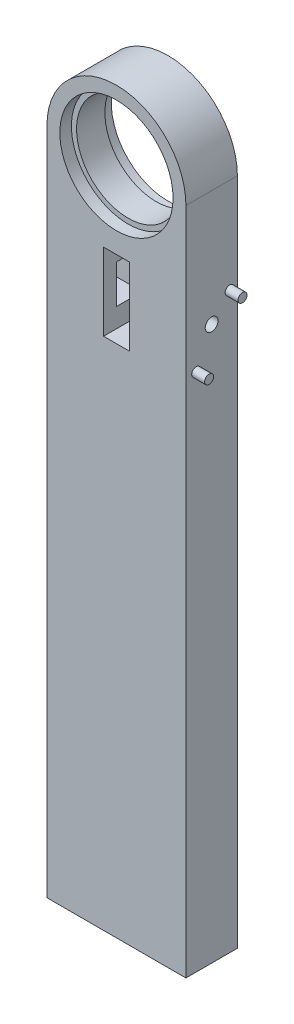
ISO-10303-21;
HEADER;
FILE_DESCRIPTION(('STEP AP214'),'2;1');
FILE_NAME('part.step','',(''),(''),'','','');
FILE_SCHEMA(('AUTOMOTIVE_DESIGN { 1 0 10303 214 1 1 1 1 }'));
ENDSEC;
DATA;
#1=APPLICATION_CONTEXT('core data for automotive mechanical design processes');
#2=APPLICATION_PROTOCOL_DEFINITION('international standard','automotive_design',2000,#1);
#3=PRODUCT_CONTEXT('',#1,'mechanical');
#4=PRODUCT('Part','Part','',(#3));
#5=PRODUCT_RELATED_PRODUCT_CATEGORY('part','',(#4));
#6=PRODUCT_DEFINITION_FORMATION('','',#4);
#7=PRODUCT_DEFINITION_CONTEXT('part definition',#1,'design');
#8=PRODUCT_DEFINITION('design','',#6,#7);
#9=PRODUCT_DEFINITION_SHAPE('','',#8);
#10=(LENGTH_UNIT() NAMED_UNIT(*) SI_UNIT(.MILLI.,.METRE.));
#11=(NAMED_UNIT(*) PLANE_ANGLE_UNIT() SI_UNIT($,.RADIAN.));
#12=(NAMED_UNIT(*) SI_UNIT($,.STERADIAN.) SOLID_ANGLE_UNIT());
#13=UNCERTAINTY_MEASURE_WITH_UNIT(LENGTH_MEASURE(1.E-05),#10,'distance_accuracy_value','');
#14=(GEOMETRIC_REPRESENTATION_CONTEXT(3) GLOBAL_UNCERTAINTY_ASSIGNED_CONTEXT((#13)) GLOBAL_UNIT_ASSIGNED_CONTEXT((#10,
#11,#12)) REPRESENTATION_CONTEXT('',''));
#15=CARTESIAN_POINT('',(0.,0.,0.));
#16=DIRECTION('',(0.,0.,1.));
#17=DIRECTION('',(1.,0.,0.));
#18=AXIS2_PLACEMENT_3D('',#15,#16,#17);
#19=CARTESIAN_POINT('',(0.,0.,-15.));
#20=DIRECTION('',(0.,0.,1.));
#21=DIRECTION('',(1.,0.,0.));
#22=AXIS2_PLACEMENT_3D('',#19,#20,#21);
#23=CYLINDRICAL_SURFACE('',#22,22.);
#24=CARTESIAN_POINT('',(0.,0.,-15.));
#25=DIRECTION('',(0.,0.,1.));
#26=DIRECTION('',(1.,0.,0.));
#27=AXIS2_PLACEMENT_3D('',#24,#25,#26);
#28=CIRCLE('',#27,22.);
#29=CARTESIAN_POINT('',(22.,0.,-15.));
#30=VERTEX_POINT('',#29);
#31=EDGE_CURVE('E237',#30,#30,#28,.T.);
#32=ORIENTED_EDGE('',*,*,#31,.F.);
#33=EDGE_LOOP('',(#32));
#34=FACE_BOUND('',#33,.T.);
#35=CARTESIAN_POINT('',(0.,0.,-10.5));
#36=DIRECTION('',(0.,0.,1.));
#37=DIRECTION('',(1.,0.,0.));
#38=AXIS2_PLACEMENT_3D('',#35,#36,#37);
#39=CIRCLE('',#38,22.);
#40=CARTESIAN_POINT('',(22.,0.,-10.5));
#41=VERTEX_POINT('',#40);
#42=EDGE_CURVE('E294',#41,#41,#39,.F.);
#43=ORIENTED_EDGE('',*,*,#42,.F.);
#44=EDGE_LOOP('',(#43));
#45=FACE_BOUND('',#44,.T.);
#46=ADVANCED_FACE('F45',(#34,#45),#23,.F.);
#47=CARTESIAN_POINT('',(0.,0.,5.));
#48=DIRECTION('',(0.,0.,1.));
#49=DIRECTION('',(1.,0.,0.));
#50=AXIS2_PLACEMENT_3D('',#47,#48,#49);
#51=PLANE('',#50);
#52=DIRECTION('',(0.,-1.,0.));
#53=VECTOR('',#52,1.);
#54=CARTESIAN_POINT('',(-5.,0.,5.));
#55=LINE('',#54,#53);
#56=CARTESIAN_POINT('',(-5.,-30.,5.));
#57=VERTEX_POINT('',#56);
#58=CARTESIAN_POINT('',(-4.99999999999999,-60.,5.));
#59=VERTEX_POINT('',#58);
#60=EDGE_CURVE('E230',#57,#59,#55,.T.);
#61=ORIENTED_EDGE('',*,*,#60,.F.);
#62=DIRECTION('',(-1.,0.,0.));
#63=VECTOR('',#62,1.);
#64=CARTESIAN_POINT('',(0.,-30.,5.));
#65=LINE('',#64,#63);
#66=CARTESIAN_POINT('',(5.,-30.,5.));
#67=VERTEX_POINT('',#66);
#68=EDGE_CURVE('E227',#67,#57,#65,.T.);
#69=ORIENTED_EDGE('',*,*,#68,.F.);
#70=DIRECTION('',(0.,1.,0.));
#71=VECTOR('',#70,1.);
#72=CARTESIAN_POINT('',(4.99999999999999,0.,5.));
#73=LINE('',#72,#71);
#74=CARTESIAN_POINT('',(5.00000000000001,-60.,5.));
#75=VERTEX_POINT('',#74);
#76=EDGE_CURVE('E224',#75,#67,#73,.T.);
#77=ORIENTED_EDGE('',*,*,#76,.F.);
#78=DIRECTION('',(1.,0.,0.));
#79=VECTOR('',#78,1.);
#80=CARTESIAN_POINT('',(0.,-60.,5.));
#81=LINE('',#80,#79);
#82=EDGE_CURVE('E211',#59,#75,#81,.T.);
#83=ORIENTED_EDGE('',*,*,#82,.F.);
#84=EDGE_LOOP('',(#61,#69,#77,#83));
#85=FACE_BOUND('',#84,.T.);
#86=DIRECTION('',(0.,-1.,0.));
#87=VECTOR('',#86,1.);
#88=CARTESIAN_POINT('',(-27.,-260.,5.));
#89=LINE('',#88,#87);
#90=CARTESIAN_POINT('',(-27.,0.,5.));
#91=VERTEX_POINT('',#90);
#92=CARTESIAN_POINT('',(-27.,-260.,5.));
#93=VERTEX_POINT('',#92);
#94=EDGE_CURVE('E265',#91,#93,#89,.T.);
#95=ORIENTED_EDGE('',*,*,#94,.T.);
#96=DIRECTION('',(1.,0.,0.));
#97=VECTOR('',#96,1.);
#98=CARTESIAN_POINT('',(-27.,-260.,5.));
#99=LINE('',#98,#97);
#100=CARTESIAN_POINT('',(27.,-260.,5.));
#101=VERTEX_POINT('',#100);
#102=EDGE_CURVE('E269',#93,#101,#99,.T.);
#103=ORIENTED_EDGE('',*,*,#102,.T.);
#104=DIRECTION('',(0.,1.,0.));
#105=VECTOR('',#104,1.);
#106=CARTESIAN_POINT('',(27.,-260.,5.));
#107=LINE('',#106,#105);
#108=CARTESIAN_POINT('',(27.,0.,5.));
#109=VERTEX_POINT('',#108);
#110=EDGE_CURVE('E272',#101,#109,#107,.T.);
#111=ORIENTED_EDGE('',*,*,#110,.T.);
#112=CARTESIAN_POINT('',(0.,0.,5.));
#113=DIRECTION('',(0.,0.,1.));
#114=DIRECTION('',(1.,0.,0.));
#115=AXIS2_PLACEMENT_3D('',#112,#113,#114);
#116=CIRCLE('',#115,27.);
#117=EDGE_CURVE('E275',#109,#91,#116,.T.);
#118=ORIENTED_EDGE('',*,*,#117,.T.);
#119=EDGE_LOOP('',(#95,#103,#111,#118));
#120=FACE_BOUND('',#119,.T.);
#121=CARTESIAN_POINT('',(0.,0.,5.));
#122=DIRECTION('',(0.,0.,1.));
#123=DIRECTION('',(1.,0.,0.));
#124=AXIS2_PLACEMENT_3D('',#121,#122,#123);
#125=CIRCLE('',#124,22.);
#126=CARTESIAN_POINT('',(22.,0.,5.));
#127=VERTEX_POINT('',#126);
#128=EDGE_CURVE('E261',#127,#127,#125,.T.);
#129=ORIENTED_EDGE('',*,*,#128,.F.);
#130=EDGE_LOOP('',(#129));
#131=FACE_BOUND('',#130,.T.);
#132=ADVANCED_FACE('F333',(#85,#120,#131),#51,.T.);
#133=CARTESIAN_POINT('',(-27.,-260.,5.));
#134=DIRECTION('',(1.,0.,0.));
#135=DIRECTION('',(0.,1.,0.));
#136=AXIS2_PLACEMENT_3D('',#133,#134,#135);
#137=PLANE('',#136);
#138=DIRECTION('',(0.,0.,-1.));
#139=VECTOR('',#138,1.);
#140=CARTESIAN_POINT('',(-27.,0.,5.));
#141=LINE('',#140,#139);
#142=CARTESIAN_POINT('',(-27.,0.,-15.));
#143=VERTEX_POINT('',#142);
#144=EDGE_CURVE('E278',#91,#143,#141,.T.);
#145=ORIENTED_EDGE('',*,*,#144,.T.);
#146=DIRECTION('',(0.,-1.,0.));
#147=VECTOR('',#146,1.);
#148=CARTESIAN_POINT('',(-27.,-260.,-15.));
#149=LINE('',#148,#147);
#150=CARTESIAN_POINT('',(-27.,-260.,-15.));
#151=VERTEX_POINT('',#150);
#152=EDGE_CURVE('E241',#143,#151,#149,.T.);
#153=ORIENTED_EDGE('',*,*,#152,.T.);
#154=DIRECTION('',(0.,0.,-1.));
#155=VECTOR('',#154,1.);
#156=CARTESIAN_POINT('',(-27.,-260.,5.));
#157=LINE('',#156,#155);
#158=EDGE_CURVE('E287',#93,#151,#157,.T.);
#159=ORIENTED_EDGE('',*,*,#158,.F.);
#160=ORIENTED_EDGE('',*,*,#94,.F.);
#161=EDGE_LOOP('',(#145,#153,#159,#160));
#162=FACE_BOUND('',#161,.T.);
#163=ADVANCED_FACE('F47',(#162),#137,.F.);
#164=CARTESIAN_POINT('',(-27.,-260.,5.));
#165=DIRECTION('',(0.,1.,0.));
#166=DIRECTION('',(0.,0.,1.));
#167=AXIS2_PLACEMENT_3D('',#164,#165,#166);
#168=PLANE('',#167);
#169=ORIENTED_EDGE('',*,*,#158,.T.);
#170=DIRECTION('',(1.,0.,0.));
#171=VECTOR('',#170,1.);
#172=CARTESIAN_POINT('',(-27.,-260.,-15.));
#173=LINE('',#172,#171);
#174=CARTESIAN_POINT('',(27.,-260.,-15.));
#175=VERTEX_POINT('',#174);
#176=EDGE_CURVE('E245',#151,#175,#173,.T.);
#177=ORIENTED_EDGE('',*,*,#176,.T.);
#178=DIRECTION('',(0.,0.,-1.));
#179=VECTOR('',#178,1.);
#180=CARTESIAN_POINT('',(27.,-260.,5.));
#181=LINE('',#180,#179);
#182=EDGE_CURVE('E284',#101,#175,#181,.T.);
#183=ORIENTED_EDGE('',*,*,#182,.F.);
#184=ORIENTED_EDGE('',*,*,#102,.F.);
#185=EDGE_LOOP('',(#169,#177,#183,#184));
#186=FACE_BOUND('',#185,.T.);
#187=ADVANCED_FACE('F310',(#186),#168,.F.);
#188=CARTESIAN_POINT('',(27.,-260.,5.));
#189=DIRECTION('',(-1.,0.,0.));
#190=DIRECTION('',(0.,-1.,0.));
#191=AXIS2_PLACEMENT_3D('',#188,#189,#190);
#192=PLANE('',#191);
#193=CARTESIAN_POINT('',(27.,-37.,-12.));
#194=DIRECTION('',(-1.,0.,0.));
#195=DIRECTION('',(0.,-1.,0.));
#196=AXIS2_PLACEMENT_3D('',#193,#194,#195);
#197=CIRCLE('',#196,1.75);
#198=CARTESIAN_POINT('',(27.,-38.75,-12.));
#199=VERTEX_POINT('',#198);
#200=EDGE_CURVE('E11',#199,#199,#197,.F.);
#201=ORIENTED_EDGE('',*,*,#200,.F.);
#202=EDGE_LOOP('',(#201));
#203=FACE_BOUND('',#202,.T.);
#204=CARTESIAN_POINT('',(27.,-58.,1.));
#205=DIRECTION('',(-1.,0.,0.));
#206=DIRECTION('',(0.,-1.,0.));
#207=AXIS2_PLACEMENT_3D('',#204,#205,#206);
#208=CIRCLE('',#207,1.75);
#209=CARTESIAN_POINT('',(27.,-59.75,1.));
#210=VERTEX_POINT('',#209);
#211=EDGE_CURVE('E54',#210,#210,#208,.F.);
#212=ORIENTED_EDGE('',*,*,#211,.F.);
#213=EDGE_LOOP('',(#212));
#214=FACE_BOUND('',#213,.T.);
#215=CARTESIAN_POINT('',(27.,-45.,-5.));
#216=DIRECTION('',(-1.,0.,0.));
#217=DIRECTION('',(0.,-1.,0.));
#218=AXIS2_PLACEMENT_3D('',#215,#216,#217);
#219=CIRCLE('',#218,2.5);
#220=CARTESIAN_POINT('',(27.,-47.5,-5.));
#221=VERTEX_POINT('',#220);
#222=EDGE_CURVE('E167',#221,#221,#219,.T.);
#223=ORIENTED_EDGE('',*,*,#222,.T.);
#224=EDGE_LOOP('',(#223));
#225=FACE_BOUND('',#224,.T.);
#226=ORIENTED_EDGE('',*,*,#182,.T.);
#227=DIRECTION('',(0.,1.,0.));
#228=VECTOR('',#227,1.);
#229=CARTESIAN_POINT('',(27.,-260.,-15.));
#230=LINE('',#229,#228);
#231=CARTESIAN_POINT('',(27.,0.,-15.));
#232=VERTEX_POINT('',#231);
#233=EDGE_CURVE('E249',#175,#232,#230,.T.);
#234=ORIENTED_EDGE('',*,*,#233,.T.);
#235=DIRECTION('',(0.,0.,-1.));
#236=VECTOR('',#235,1.);
#237=CARTESIAN_POINT('',(27.,0.,5.));
#238=LINE('',#237,#236);
#239=EDGE_CURVE('E281',#109,#232,#238,.T.);
#240=ORIENTED_EDGE('',*,*,#239,.F.);
#241=ORIENTED_EDGE('',*,*,#110,.F.);
#242=EDGE_LOOP('',(#226,#234,#240,#241));
#243=FACE_BOUND('',#242,.T.);
#244=ADVANCED_FACE('F306',(#203,#214,#225,#243),#192,.F.);
#245=CARTESIAN_POINT('',(0.,0.,5.));
#246=DIRECTION('',(0.,0.,-1.));
#247=DIRECTION('',(-1.,0.,0.));
#248=AXIS2_PLACEMENT_3D('',#245,#246,#247);
#249=CYLINDRICAL_SURFACE('',#248,27.);
#250=ORIENTED_EDGE('',*,*,#239,.T.);
#251=CARTESIAN_POINT('',(0.,0.,-15.));
#252=DIRECTION('',(0.,0.,1.));
#253=DIRECTION('',(1.,0.,0.));
#254=AXIS2_PLACEMENT_3D('',#251,#252,#253);
#255=CIRCLE('',#254,27.);
#256=EDGE_CURVE('E253',#232,#143,#255,.T.);
#257=ORIENTED_EDGE('',*,*,#256,.T.);
#258=ORIENTED_EDGE('',*,*,#144,.F.);
#259=ORIENTED_EDGE('',*,*,#117,.F.);
#260=EDGE_LOOP('',(#250,#257,#258,#259));
#261=FACE_BOUND('',#260,.T.);
#262=ADVANCED_FACE('F309',(#261),#249,.T.);
#263=CARTESIAN_POINT('',(0.,0.,5.));
#264=DIRECTION('',(0.,0.,-1.));
#265=DIRECTION('',(-1.,0.,0.));
#266=AXIS2_PLACEMENT_3D('',#263,#264,#265);
#267=CYLINDRICAL_SURFACE('',#266,22.);
#268=CARTESIAN_POINT('',(0.,0.,0.5));
#269=DIRECTION('',(0.,0.,1.));
#270=DIRECTION('',(1.,0.,0.));
#271=AXIS2_PLACEMENT_3D('',#268,#269,#270);
#272=CIRCLE('',#271,22.);
#273=CARTESIAN_POINT('',(22.,0.,0.5));
#274=VERTEX_POINT('',#273);
#275=EDGE_CURVE('E290',#274,#274,#272,.T.);
#276=ORIENTED_EDGE('',*,*,#275,.F.);
#277=EDGE_LOOP('',(#276));
#278=FACE_BOUND('',#277,.T.);
#279=ORIENTED_EDGE('',*,*,#128,.T.);
#280=EDGE_LOOP('',(#279));
#281=FACE_BOUND('',#280,.T.);
#282=ADVANCED_FACE('F340',(#278,#281),#267,.F.);
#283=CARTESIAN_POINT('',(0.,0.,0.5));
#284=DIRECTION('',(0.,0.,1.));
#285=DIRECTION('',(1.,0.,0.));
#286=AXIS2_PLACEMENT_3D('',#283,#284,#285);
#287=PLANE('',#286);
#288=ORIENTED_EDGE('',*,*,#275,.T.);
#289=EDGE_LOOP('',(#288));
#290=FACE_BOUND('',#289,.T.);
#291=CARTESIAN_POINT('',(0.,0.,0.5));
#292=DIRECTION('',(0.,0.,1.));
#293=DIRECTION('',(1.,0.,0.));
#294=AXIS2_PLACEMENT_3D('',#291,#292,#293);
#295=CIRCLE('',#294,20.);
#296=CARTESIAN_POINT('',(20.,0.,0.5));
#297=VERTEX_POINT('',#296);
#298=EDGE_CURVE('E257',#297,#297,#295,.T.);
#299=ORIENTED_EDGE('',*,*,#298,.F.);
#300=EDGE_LOOP('',(#299));
#301=FACE_BOUND('',#300,.T.);
#302=ADVANCED_FACE('F342',(#290,#301),#287,.T.);
#303=CARTESIAN_POINT('',(0.,0.,0.5));
#304=DIRECTION('',(0.,0.,-1.));
#305=DIRECTION('',(-1.,0.,0.));
#306=AXIS2_PLACEMENT_3D('',#303,#304,#305);
#307=CYLINDRICAL_SURFACE('',#306,20.);
#308=ORIENTED_EDGE('',*,*,#298,.T.);
#309=EDGE_LOOP('',(#308));
#310=FACE_BOUND('',#309,.T.);
#311=CARTESIAN_POINT('',(0.,0.,-10.5));
#312=DIRECTION('',(0.,0.,1.));
#313=DIRECTION('',(1.,0.,0.));
#314=AXIS2_PLACEMENT_3D('',#311,#312,#313);
#315=CIRCLE('',#314,20.);
#316=CARTESIAN_POINT('',(20.,0.,-10.5));
#317=VERTEX_POINT('',#316);
#318=EDGE_CURVE('E233',#317,#317,#315,.T.);
#319=ORIENTED_EDGE('',*,*,#318,.F.);
#320=EDGE_LOOP('',(#319));
#321=FACE_BOUND('',#320,.T.);
#322=ADVANCED_FACE('F348',(#310,#321),#307,.F.);
#323=CARTESIAN_POINT('',(0.,0.,-15.));
#324=DIRECTION('',(0.,0.,1.));
#325=DIRECTION('',(1.,0.,0.));
#326=AXIS2_PLACEMENT_3D('',#323,#324,#325);
#327=PLANE('',#326);
#328=DIRECTION('',(-1.,0.,0.));
#329=VECTOR('',#328,1.);
#330=CARTESIAN_POINT('',(-5.,-30.,-15.));
#331=LINE('',#330,#329);
#332=CARTESIAN_POINT('',(5.,-30.,-15.));
#333=VERTEX_POINT('',#332);
#334=CARTESIAN_POINT('',(-5.,-30.,-15.));
#335=VERTEX_POINT('',#334);
#336=EDGE_CURVE('E203',#333,#335,#331,.T.);
#337=ORIENTED_EDGE('',*,*,#336,.T.);
#338=DIRECTION('',(0.,-1.,0.));
#339=VECTOR('',#338,1.);
#340=CARTESIAN_POINT('',(-5.,-30.,-15.));
#341=LINE('',#340,#339);
#342=CARTESIAN_POINT('',(-4.99999999999999,-60.,-15.));
#343=VERTEX_POINT('',#342);
#344=EDGE_CURVE('E186',#335,#343,#341,.T.);
#345=ORIENTED_EDGE('',*,*,#344,.T.);
#346=DIRECTION('',(1.,0.,0.));
#347=VECTOR('',#346,1.);
#348=CARTESIAN_POINT('',(-4.99999999999999,-60.,-15.));
#349=LINE('',#348,#347);
#350=CARTESIAN_POINT('',(5.00000000000001,-60.,-15.));
#351=VERTEX_POINT('',#350);
#352=EDGE_CURVE('E195',#343,#351,#349,.T.);
#353=ORIENTED_EDGE('',*,*,#352,.T.);
#354=DIRECTION('',(0.,1.,0.));
#355=VECTOR('',#354,1.);
#356=CARTESIAN_POINT('',(5.,-30.,-15.));
#357=LINE('',#356,#355);
#358=EDGE_CURVE('E199',#351,#333,#357,.T.);
#359=ORIENTED_EDGE('',*,*,#358,.T.);
#360=EDGE_LOOP('',(#337,#345,#353,#359));
#361=FACE_BOUND('',#360,.T.);
#362=ORIENTED_EDGE('',*,*,#31,.T.);
#363=EDGE_LOOP('',(#362));
#364=FACE_BOUND('',#363,.T.);
#365=ORIENTED_EDGE('',*,*,#152,.F.);
#366=ORIENTED_EDGE('',*,*,#256,.F.);
#367=ORIENTED_EDGE('',*,*,#233,.F.);
#368=ORIENTED_EDGE('',*,*,#176,.F.);
#369=EDGE_LOOP('',(#365,#366,#367,#368));
#370=FACE_BOUND('',#369,.T.);
#371=ADVANCED_FACE('F325',(#361,#364,#370),#327,.F.);
#372=CARTESIAN_POINT('',(0.,0.,-10.5));
#373=DIRECTION('',(0.,0.,1.));
#374=DIRECTION('',(1.,0.,0.));
#375=AXIS2_PLACEMENT_3D('',#372,#373,#374);
#376=PLANE('',#375);
#377=ORIENTED_EDGE('',*,*,#318,.T.);
#378=EDGE_LOOP('',(#377));
#379=FACE_BOUND('',#378,.T.);
#380=ORIENTED_EDGE('',*,*,#42,.T.);
#381=EDGE_LOOP('',(#380));
#382=FACE_BOUND('',#381,.T.);
#383=ADVANCED_FACE('F364',(#379,#382),#376,.F.);
#384=CARTESIAN_POINT('',(-5.,-30.,-15.));
#385=DIRECTION('',(-1.,0.,0.));
#386=DIRECTION('',(0.,-1.,0.));
#387=AXIS2_PLACEMENT_3D('',#384,#385,#386);
#388=PLANE('',#387);
#389=DIRECTION('',(0.,0.,1.));
#390=VECTOR('',#389,1.);
#391=CARTESIAN_POINT('',(-5.,-37.5,-10.));
#392=LINE('',#391,#390);
#393=CARTESIAN_POINT('',(-5.,-37.5,-10.));
#394=VERTEX_POINT('',#393);
#395=CARTESIAN_POINT('',(-5.,-37.5,0.));
#396=VERTEX_POINT('',#395);
#397=EDGE_CURVE('E187',#394,#396,#392,.T.);
#398=ORIENTED_EDGE('',*,*,#397,.F.);
#399=DIRECTION('',(0.,1.,0.));
#400=VECTOR('',#399,1.);
#401=CARTESIAN_POINT('',(-5.,-52.5,-10.));
#402=LINE('',#401,#400);
#403=CARTESIAN_POINT('',(-5.,-52.5,-10.));
#404=VERTEX_POINT('',#403);
#405=EDGE_CURVE('E157',#404,#394,#402,.T.);
#406=ORIENTED_EDGE('',*,*,#405,.F.);
#407=DIRECTION('',(0.,0.,1.));
#408=VECTOR('',#407,1.);
#409=CARTESIAN_POINT('',(-5.,-52.5,-10.));
#410=LINE('',#409,#408);
#411=CARTESIAN_POINT('',(-5.,-52.5,0.));
#412=VERTEX_POINT('',#411);
#413=EDGE_CURVE('E147',#404,#412,#410,.T.);
#414=ORIENTED_EDGE('',*,*,#413,.T.);
#415=DIRECTION('',(0.,1.,0.));
#416=VECTOR('',#415,1.);
#417=CARTESIAN_POINT('',(-5.,-47.5,0.));
#418=LINE('',#417,#416);
#419=EDGE_CURVE('E164',#412,#396,#418,.T.);
#420=ORIENTED_EDGE('',*,*,#419,.T.);
#421=EDGE_LOOP('',(#398,#406,#414,#420));
#422=FACE_BOUND('',#421,.T.);
#423=ORIENTED_EDGE('',*,*,#60,.T.);
#424=DIRECTION('',(0.,0.,1.));
#425=VECTOR('',#424,1.);
#426=CARTESIAN_POINT('',(-4.99999999999999,-60.,-15.));
#427=LINE('',#426,#425);
#428=EDGE_CURVE('E69',#343,#59,#427,.T.);
#429=ORIENTED_EDGE('',*,*,#428,.F.);
#430=ORIENTED_EDGE('',*,*,#344,.F.);
#431=DIRECTION('',(0.,0.,1.));
#432=VECTOR('',#431,1.);
#433=CARTESIAN_POINT('',(-5.,-30.,-15.));
#434=LINE('',#433,#432);
#435=EDGE_CURVE('E207',#335,#57,#434,.T.);
#436=ORIENTED_EDGE('',*,*,#435,.T.);
#437=EDGE_LOOP('',(#423,#429,#430,#436));
#438=FACE_BOUND('',#437,.T.);
#439=ADVANCED_FACE('F378',(#422,#438),#388,.F.);
#440=CARTESIAN_POINT('',(-5.,-30.,-15.));
#441=DIRECTION('',(0.,1.,0.));
#442=DIRECTION('',(0.,0.,1.));
#443=AXIS2_PLACEMENT_3D('',#440,#441,#442);
#444=PLANE('',#443);
#445=ORIENTED_EDGE('',*,*,#68,.T.);
#446=ORIENTED_EDGE('',*,*,#435,.F.);
#447=ORIENTED_EDGE('',*,*,#336,.F.);
#448=DIRECTION('',(0.,0.,1.));
#449=VECTOR('',#448,1.);
#450=CARTESIAN_POINT('',(5.,-30.,-15.));
#451=LINE('',#450,#449);
#452=EDGE_CURVE('E212',#333,#67,#451,.T.);
#453=ORIENTED_EDGE('',*,*,#452,.T.);
#454=EDGE_LOOP('',(#445,#446,#447,#453));
#455=FACE_BOUND('',#454,.T.);
#456=ADVANCED_FACE('F383',(#455),#444,.F.);
#457=CARTESIAN_POINT('',(5.,-30.,-15.));
#458=DIRECTION('',(1.,0.,0.));
#459=DIRECTION('',(0.,1.,0.));
#460=AXIS2_PLACEMENT_3D('',#457,#458,#459);
#461=PLANE('',#460);
#462=CARTESIAN_POINT('',(5.00000000000001,-45.,-5.));
#463=DIRECTION('',(1.,0.,0.));
#464=DIRECTION('',(0.,1.,0.));
#465=AXIS2_PLACEMENT_3D('',#462,#463,#464);
#466=CIRCLE('',#465,2.5);
#467=CARTESIAN_POINT('',(5.00000000000001,-42.5,-5.));
#468=VERTEX_POINT('',#467);
#469=EDGE_CURVE('E177',#468,#468,#466,.F.);
#470=ORIENTED_EDGE('',*,*,#469,.F.);
#471=EDGE_LOOP('',(#470));
#472=FACE_BOUND('',#471,.T.);
#473=ORIENTED_EDGE('',*,*,#76,.T.);
#474=ORIENTED_EDGE('',*,*,#452,.F.);
#475=ORIENTED_EDGE('',*,*,#358,.F.);
#476=DIRECTION('',(0.,0.,1.));
#477=VECTOR('',#476,1.);
#478=CARTESIAN_POINT('',(5.00000000000001,-60.,-15.));
#479=LINE('',#478,#477);
#480=EDGE_CURVE('E216',#351,#75,#479,.T.);
#481=ORIENTED_EDGE('',*,*,#480,.T.);
#482=EDGE_LOOP('',(#473,#474,#475,#481));
#483=FACE_BOUND('',#482,.T.);
#484=ADVANCED_FACE('F390',(#472,#483),#461,.F.);
#485=CARTESIAN_POINT('',(-4.99999999999999,-60.,-15.));
#486=DIRECTION('',(0.,-1.,0.));
#487=DIRECTION('',(0.,0.,-1.));
#488=AXIS2_PLACEMENT_3D('',#485,#486,#487);
#489=PLANE('',#488);
#490=ORIENTED_EDGE('',*,*,#82,.T.);
#491=ORIENTED_EDGE('',*,*,#480,.F.);
#492=ORIENTED_EDGE('',*,*,#352,.F.);
#493=ORIENTED_EDGE('',*,*,#428,.T.);
#494=EDGE_LOOP('',(#490,#491,#492,#493));
#495=FACE_BOUND('',#494,.T.);
#496=ADVANCED_FACE('F396',(#495),#489,.F.);
#497=CARTESIAN_POINT('',(-15.,-52.5,-10.));
#498=DIRECTION('',(-1.,0.,0.));
#499=DIRECTION('',(0.,0.,1.));
#500=AXIS2_PLACEMENT_3D('',#497,#498,#499);
#501=PLANE('',#500);
#502=DIRECTION('',(0.,-1.,0.));
#503=VECTOR('',#502,1.);
#504=CARTESIAN_POINT('',(-15.,-52.5,0.));
#505=LINE('',#504,#503);
#506=CARTESIAN_POINT('',(-15.,-37.5,0.));
#507=VERTEX_POINT('',#506);
#508=CARTESIAN_POINT('',(-15.,-52.5,0.));
#509=VERTEX_POINT('',#508);
#510=EDGE_CURVE('E142',#507,#509,#505,.T.);
#511=ORIENTED_EDGE('',*,*,#510,.T.);
#512=DIRECTION('',(0.,0.,1.));
#513=VECTOR('',#512,1.);
#514=CARTESIAN_POINT('',(-15.,-52.5,-10.));
#515=LINE('',#514,#513);
#516=CARTESIAN_POINT('',(-15.,-52.5,-10.));
#517=VERTEX_POINT('',#516);
#518=EDGE_CURVE('E136',#517,#509,#515,.T.);
#519=ORIENTED_EDGE('',*,*,#518,.F.);
#520=DIRECTION('',(0.,-1.,0.));
#521=VECTOR('',#520,1.);
#522=CARTESIAN_POINT('',(-15.,-52.5,-10.));
#523=LINE('',#522,#521);
#524=CARTESIAN_POINT('',(-15.,-37.5,-10.));
#525=VERTEX_POINT('',#524);
#526=EDGE_CURVE('E140',#525,#517,#523,.T.);
#527=ORIENTED_EDGE('',*,*,#526,.F.);
#528=DIRECTION('',(0.,0.,1.));
#529=VECTOR('',#528,1.);
#530=CARTESIAN_POINT('',(-15.,-37.5,-10.));
#531=LINE('',#530,#529);
#532=EDGE_CURVE('E183',#525,#507,#531,.T.);
#533=ORIENTED_EDGE('',*,*,#532,.T.);
#534=EDGE_LOOP('',(#511,#519,#527,#533));
#535=FACE_BOUND('',#534,.T.);
#536=ADVANCED_FACE('F138',(#535),#501,.F.);
#537=CARTESIAN_POINT('',(-15.,-37.5,-10.));
#538=DIRECTION('',(0.,1.,0.));
#539=DIRECTION('',(0.,0.,1.));
#540=AXIS2_PLACEMENT_3D('',#537,#538,#539);
#541=PLANE('',#540);
#542=DIRECTION('',(-1.,0.,0.));
#543=VECTOR('',#542,1.);
#544=CARTESIAN_POINT('',(-15.,-37.5,0.));
#545=LINE('',#544,#543);
#546=EDGE_CURVE('E61',#396,#507,#545,.T.);
#547=ORIENTED_EDGE('',*,*,#546,.T.);
#548=ORIENTED_EDGE('',*,*,#532,.F.);
#549=DIRECTION('',(-1.,0.,0.));
#550=VECTOR('',#549,1.);
#551=CARTESIAN_POINT('',(-15.,-37.5,-10.));
#552=LINE('',#551,#550);
#553=EDGE_CURVE('E148',#394,#525,#552,.T.);
#554=ORIENTED_EDGE('',*,*,#553,.F.);
#555=ORIENTED_EDGE('',*,*,#397,.T.);
#556=EDGE_LOOP('',(#547,#548,#554,#555));
#557=FACE_BOUND('',#556,.T.);
#558=ADVANCED_FACE('F402',(#557),#541,.F.);
#559=CARTESIAN_POINT('',(-15.,-52.5,-10.));
#560=DIRECTION('',(0.,-1.,0.));
#561=DIRECTION('',(0.,0.,-1.));
#562=AXIS2_PLACEMENT_3D('',#559,#560,#561);
#563=PLANE('',#562);
#564=DIRECTION('',(1.,0.,0.));
#565=VECTOR('',#564,1.);
#566=CARTESIAN_POINT('',(-15.,-52.5,0.));
#567=LINE('',#566,#565);
#568=EDGE_CURVE('E176',#509,#412,#567,.T.);
#569=ORIENTED_EDGE('',*,*,#568,.T.);
#570=ORIENTED_EDGE('',*,*,#413,.F.);
#571=DIRECTION('',(1.,0.,0.));
#572=VECTOR('',#571,1.);
#573=CARTESIAN_POINT('',(-15.,-52.5,-10.));
#574=LINE('',#573,#572);
#575=EDGE_CURVE('E151',#517,#404,#574,.T.);
#576=ORIENTED_EDGE('',*,*,#575,.F.);
#577=ORIENTED_EDGE('',*,*,#518,.T.);
#578=EDGE_LOOP('',(#569,#570,#576,#577));
#579=FACE_BOUND('',#578,.T.);
#580=ADVANCED_FACE('F152',(#579),#563,.F.);
#581=CARTESIAN_POINT('',(0.,0.,-10.));
#582=DIRECTION('',(0.,0.,-1.));
#583=DIRECTION('',(-1.,0.,0.));
#584=AXIS2_PLACEMENT_3D('',#581,#582,#583);
#585=PLANE('',#584);
#586=ORIENTED_EDGE('',*,*,#526,.T.);
#587=ORIENTED_EDGE('',*,*,#575,.T.);
#588=ORIENTED_EDGE('',*,*,#405,.T.);
#589=ORIENTED_EDGE('',*,*,#553,.T.);
#590=EDGE_LOOP('',(#586,#587,#588,#589));
#591=FACE_BOUND('',#590,.T.);
#592=ADVANCED_FACE('F159',(#591),#585,.F.);
#593=CARTESIAN_POINT('',(0.,0.,0.));
#594=DIRECTION('',(0.,0.,-1.));
#595=DIRECTION('',(-1.,0.,0.));
#596=AXIS2_PLACEMENT_3D('',#593,#594,#595);
#597=PLANE('',#596);
#598=ORIENTED_EDGE('',*,*,#510,.F.);
#599=ORIENTED_EDGE('',*,*,#546,.F.);
#600=ORIENTED_EDGE('',*,*,#419,.F.);
#601=ORIENTED_EDGE('',*,*,#568,.F.);
#602=EDGE_LOOP('',(#598,#599,#600,#601));
#603=FACE_BOUND('',#602,.T.);
#604=ADVANCED_FACE('F408',(#603),#597,.T.);
#605=CARTESIAN_POINT('',(34.0710678118655,-45.,-5.));
#606=DIRECTION('',(-1.,0.,0.));
#607=DIRECTION('',(0.,0.,1.));
#608=AXIS2_PLACEMENT_3D('',#605,#606,#607);
#609=CYLINDRICAL_SURFACE('',#608,2.5);
#610=ORIENTED_EDGE('',*,*,#222,.F.);
#611=EDGE_LOOP('',(#610));
#612=FACE_BOUND('',#611,.T.);
#613=ORIENTED_EDGE('',*,*,#469,.T.);
#614=EDGE_LOOP('',(#613));
#615=FACE_BOUND('',#614,.T.);
#616=ADVANCED_FACE('F411',(#612,#615),#609,.F.);
#617=CARTESIAN_POINT('',(32.,-58.,1.));
#618=DIRECTION('',(-1.,0.,0.));
#619=DIRECTION('',(0.,-1.,0.));
#620=AXIS2_PLACEMENT_3D('',#617,#618,#619);
#621=CYLINDRICAL_SURFACE('',#620,1.75);
#622=CARTESIAN_POINT('',(32.,-58.,1.));
#623=DIRECTION('',(1.,0.,0.));
#624=DIRECTION('',(0.,1.,0.));
#625=AXIS2_PLACEMENT_3D('',#622,#623,#624);
#626=CIRCLE('',#625,1.75);
#627=CARTESIAN_POINT('',(32.,-56.25,1.));
#628=VERTEX_POINT('',#627);
#629=EDGE_CURVE('E437',#628,#628,#626,.T.);
#630=ORIENTED_EDGE('',*,*,#629,.F.);
#631=EDGE_LOOP('',(#630));
#632=FACE_BOUND('',#631,.T.);
#633=ORIENTED_EDGE('',*,*,#211,.T.);
#634=EDGE_LOOP('',(#633));
#635=FACE_BOUND('',#634,.T.);
#636=ADVANCED_FACE('F304',(#632,#635),#621,.T.);
#637=CARTESIAN_POINT('',(32.,-58.,1.));
#638=DIRECTION('',(1.,0.,0.));
#639=DIRECTION('',(0.,1.,0.));
#640=AXIS2_PLACEMENT_3D('',#637,#638,#639);
#641=PLANE('',#640);
#642=ORIENTED_EDGE('',*,*,#629,.T.);
#643=EDGE_LOOP('',(#642));
#644=FACE_BOUND('',#643,.T.);
#645=ADVANCED_FACE('F417',(#644),#641,.T.);
#646=CARTESIAN_POINT('',(32.,-37.,-12.));
#647=DIRECTION('',(-1.,0.,0.));
#648=DIRECTION('',(0.,-1.,0.));
#649=AXIS2_PLACEMENT_3D('',#646,#647,#648);
#650=CYLINDRICAL_SURFACE('',#649,1.75);
#651=CARTESIAN_POINT('',(32.,-37.,-12.));
#652=DIRECTION('',(1.,0.,0.));
#653=DIRECTION('',(0.,1.,0.));
#654=AXIS2_PLACEMENT_3D('',#651,#652,#653);
#655=CIRCLE('',#654,1.75);
#656=CARTESIAN_POINT('',(32.,-35.25,-12.));
#657=VERTEX_POINT('',#656);
#658=EDGE_CURVE('E435',#657,#657,#655,.T.);
#659=ORIENTED_EDGE('',*,*,#658,.F.);
#660=EDGE_LOOP('',(#659));
#661=FACE_BOUND('',#660,.T.);
#662=ORIENTED_EDGE('',*,*,#200,.T.);
#663=EDGE_LOOP('',(#662));
#664=FACE_BOUND('',#663,.T.);
#665=ADVANCED_FACE('F420',(#661,#664),#650,.T.);
#666=CARTESIAN_POINT('',(32.,-37.,-12.));
#667=DIRECTION('',(1.,0.,0.));
#668=DIRECTION('',(0.,1.,0.));
#669=AXIS2_PLACEMENT_3D('',#666,#667,#668);
#670=PLANE('',#669);
#671=ORIENTED_EDGE('',*,*,#658,.T.);
#672=EDGE_LOOP('',(#671));
#673=FACE_BOUND('',#672,.T.);
#674=ADVANCED_FACE('F427',(#673),#670,.T.);
#675=CLOSED_SHELL('',(#46,#132,#163,#187,#244,#262,#282,#302,#322,#371,#383,#439,#456,#484,#496,
#536,#558,#580,#592,#604,#616,#636,#645,#665,#674));
#676=MANIFOLD_SOLID_BREP('B2',#675);
#677=ADVANCED_BREP_SHAPE_REPRESENTATION('',(#18,#676),#14);
#678=SHAPE_DEFINITION_REPRESENTATION(#9,#677);
ENDSEC;
END-ISO-10303-21;
